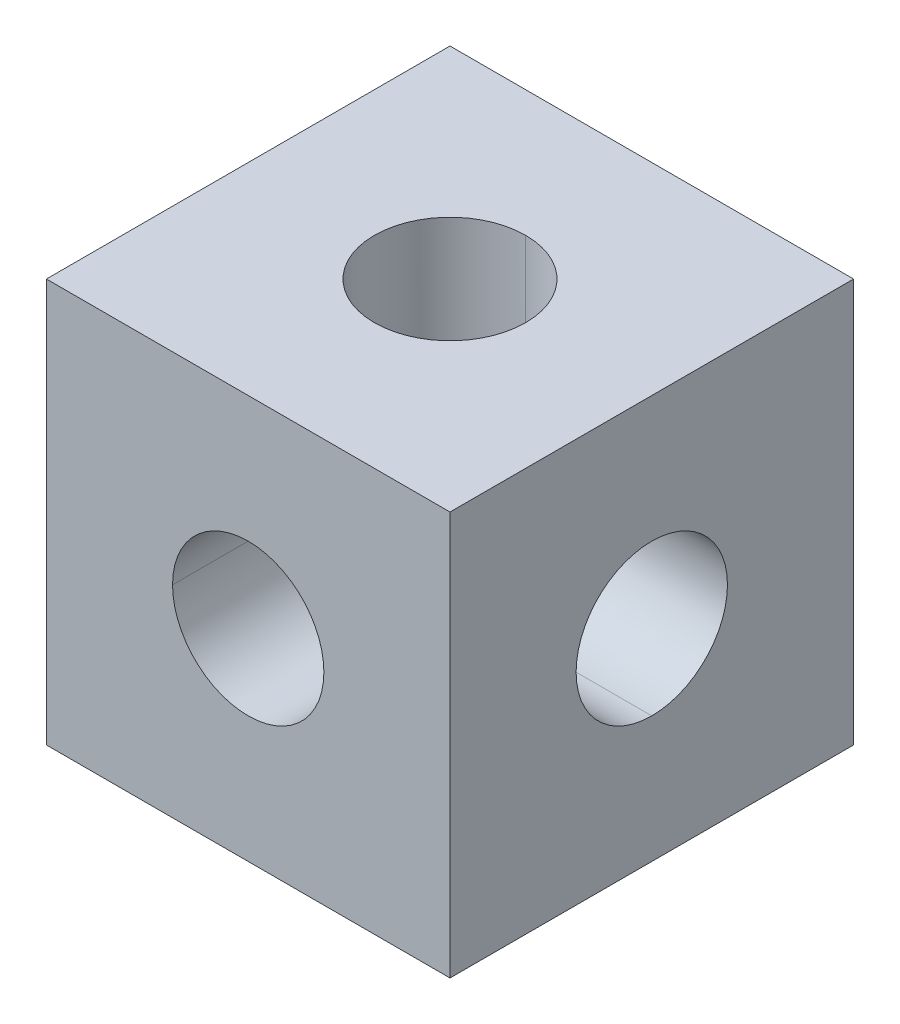
ISO-10303-21;
HEADER;
FILE_DESCRIPTION(('STEP AP214'),'2;1');
FILE_NAME('part.step','',(''),(''),'','','');
FILE_SCHEMA(('AUTOMOTIVE_DESIGN { 1 0 10303 214 1 1 1 1 }'));
ENDSEC;
DATA;
#1=APPLICATION_CONTEXT('core data for automotive mechanical design processes');
#2=APPLICATION_PROTOCOL_DEFINITION('international standard','automotive_design',2000,#1);
#3=PRODUCT_CONTEXT('',#1,'mechanical');
#4=PRODUCT('Part','Part','',(#3));
#5=PRODUCT_RELATED_PRODUCT_CATEGORY('part','',(#4));
#6=PRODUCT_DEFINITION_FORMATION('','',#4);
#7=PRODUCT_DEFINITION_CONTEXT('part definition',#1,'design');
#8=PRODUCT_DEFINITION('design','',#6,#7);
#9=PRODUCT_DEFINITION_SHAPE('','',#8);
#10=(LENGTH_UNIT() NAMED_UNIT(*) SI_UNIT(.MILLI.,.METRE.));
#11=(NAMED_UNIT(*) PLANE_ANGLE_UNIT() SI_UNIT($,.RADIAN.));
#12=(NAMED_UNIT(*) SI_UNIT($,.STERADIAN.) SOLID_ANGLE_UNIT());
#13=UNCERTAINTY_MEASURE_WITH_UNIT(LENGTH_MEASURE(1.E-05),#10,'distance_accuracy_value','');
#14=(GEOMETRIC_REPRESENTATION_CONTEXT(3) GLOBAL_UNCERTAINTY_ASSIGNED_CONTEXT((#13)) GLOBAL_UNIT_ASSIGNED_CONTEXT((#10,
#11,#12)) REPRESENTATION_CONTEXT('',''));
#15=CARTESIAN_POINT('',(0.,0.,0.));
#16=DIRECTION('',(0.,0.,1.));
#17=DIRECTION('',(1.,0.,0.));
#18=AXIS2_PLACEMENT_3D('',#15,#16,#17);
#19=CARTESIAN_POINT('',(4.,0.,4.));
#20=DIRECTION('',(-1.,0.,0.));
#21=DIRECTION('',(0.,-1.,0.));
#22=AXIS2_PLACEMENT_3D('',#19,#20,#21);
#23=CYLINDRICAL_SURFACE('',#22,1.5);
#24=CARTESIAN_POINT('',(4.,0.,4.));
#25=DIRECTION('',(-1.,0.,0.));
#26=DIRECTION('',(0.,-1.,0.));
#27=AXIS2_PLACEMENT_3D('',#24,#25,#26);
#28=CIRCLE('',#27,1.5);
#29=CARTESIAN_POINT('',(4.,1.5,4.));
#30=VERTEX_POINT('',#29);
#31=CARTESIAN_POINT('',(4.,-1.5,4.));
#32=VERTEX_POINT('',#31);
#33=EDGE_CURVE('E41',#30,#32,#28,.T.);
#34=ORIENTED_EDGE('',*,*,#33,.F.);
#35=DIRECTION('',(-1.,0.,0.));
#36=VECTOR('',#35,1.);
#37=CARTESIAN_POINT('',(4.,1.5,4.));
#38=LINE('',#37,#36);
#39=CARTESIAN_POINT('',(1.5,1.5,4.));
#40=VERTEX_POINT('',#39);
#41=EDGE_CURVE('E11',#30,#40,#38,.T.);
#42=ORIENTED_EDGE('',*,*,#41,.T.);
#43=CARTESIAN_POINT('',(1.06066017177982,1.06066017177982,2.93933982822018));
#44=CARTESIAN_POINT('',(1.34572436846349,1.34572436846349,3.22440402490385));
#45=CARTESIAN_POINT('',(1.5,1.5,3.59685834690297));
#46=CARTESIAN_POINT('',(1.5,1.5,4.));
#47=(BOUNDED_CURVE() B_SPLINE_CURVE(3,(#43,#44,#45,#46),.UNSPECIFIED.,.F.,
.F.) B_SPLINE_CURVE_WITH_KNOTS((4,4),(5.49778714378214,6.28318530717959),
.UNSPECIFIED.) CURVE() GEOMETRIC_REPRESENTATION_ITEM() RATIONAL_B_SPLINE_CURVE((1.,
0.949253021674191,0.949253021674191,1.)) REPRESENTATION_ITEM(''));
#48=CARTESIAN_POINT('',(1.06066017177982,1.06066017177982,2.93933982822018));
#49=VERTEX_POINT('',#48);
#50=EDGE_CURVE('E384',#49,#40,#47,.T.);
#51=ORIENTED_EDGE('',*,*,#50,.F.);
#52=CARTESIAN_POINT('',(1.06066017177982,1.06066017177982,2.93933982822018));
#53=CARTESIAN_POINT('',(1.34572436846349,0.775595975096153,2.65427563153651));
#54=CARTESIAN_POINT('',(1.5,0.403141653097036,2.5));
#55=CARTESIAN_POINT('',(1.5,0.,2.5));
#56=(BOUNDED_CURVE() B_SPLINE_CURVE(3,(#52,#53,#54,#55),.UNSPECIFIED.,.F.,
.F.) B_SPLINE_CURVE_WITH_KNOTS((4,4),(5.49778714378214,6.28318530717959),
.UNSPECIFIED.) CURVE() GEOMETRIC_REPRESENTATION_ITEM() RATIONAL_B_SPLINE_CURVE((1.,
0.949253021674191,0.949253021674191,1.)) REPRESENTATION_ITEM(''));
#57=CARTESIAN_POINT('',(1.5,0.,2.5));
#58=VERTEX_POINT('',#57);
#59=EDGE_CURVE('E28',#49,#58,#56,.T.);
#60=ORIENTED_EDGE('',*,*,#59,.T.);
#61=CARTESIAN_POINT('',(1.5,0.,2.5));
#62=CARTESIAN_POINT('',(1.5,-0.403141653097036,2.5));
#63=CARTESIAN_POINT('',(1.34572436846349,-0.775595975096152,2.65427563153651));
#64=CARTESIAN_POINT('',(1.06066017177982,-1.06066017177982,2.93933982822018));
#65=(BOUNDED_CURVE() B_SPLINE_CURVE(3,(#61,#62,#63,#64),.UNSPECIFIED.,.F.,
.F.) B_SPLINE_CURVE_WITH_KNOTS((4,4),(0.,0.785398163397449),
.UNSPECIFIED.) CURVE() GEOMETRIC_REPRESENTATION_ITEM() RATIONAL_B_SPLINE_CURVE((1.,
0.949253021674191,0.949253021674191,1.)) REPRESENTATION_ITEM(''));
#66=CARTESIAN_POINT('',(1.06066017177982,-1.06066017177982,2.93933982822018));
#67=VERTEX_POINT('',#66);
#68=EDGE_CURVE('E310',#58,#67,#65,.T.);
#69=ORIENTED_EDGE('',*,*,#68,.T.);
#70=CARTESIAN_POINT('',(1.5,-1.5,4.));
#71=CARTESIAN_POINT('',(1.5,-1.5,3.59685834690297));
#72=CARTESIAN_POINT('',(1.34572436846349,-1.34572436846349,3.22440402490385));
#73=CARTESIAN_POINT('',(1.06066017177982,-1.06066017177982,2.93933982822018));
#74=(BOUNDED_CURVE() B_SPLINE_CURVE(3,(#70,#71,#72,#73),.UNSPECIFIED.,.F.,
.F.) B_SPLINE_CURVE_WITH_KNOTS((4,4),(3.1415926535898,3.92699081698724),
.UNSPECIFIED.) CURVE() GEOMETRIC_REPRESENTATION_ITEM() RATIONAL_B_SPLINE_CURVE((1.,
0.949253021674191,0.949253021674191,1.)) REPRESENTATION_ITEM(''));
#75=CARTESIAN_POINT('',(1.5,-1.5,4.));
#76=VERTEX_POINT('',#75);
#77=EDGE_CURVE('E371',#76,#67,#74,.T.);
#78=ORIENTED_EDGE('',*,*,#77,.F.);
#79=DIRECTION('',(-1.,0.,0.));
#80=VECTOR('',#79,1.);
#81=CARTESIAN_POINT('',(4.,-1.5,4.));
#82=LINE('',#81,#80);
#83=EDGE_CURVE('E210',#32,#76,#82,.T.);
#84=ORIENTED_EDGE('',*,*,#83,.F.);
#85=EDGE_LOOP('',(#34,#42,#51,#60,#69,#78,#84));
#86=FACE_BOUND('',#85,.T.);
#87=ADVANCED_FACE('F17',(#86),#23,.F.);
#88=CARTESIAN_POINT('',(4.,0.,4.));
#89=DIRECTION('',(-1.,0.,0.));
#90=DIRECTION('',(0.,-1.,0.));
#91=AXIS2_PLACEMENT_3D('',#88,#89,#90);
#92=CYLINDRICAL_SURFACE('',#91,1.5);
#93=CARTESIAN_POINT('',(-1.5,1.5,4.));
#94=CARTESIAN_POINT('',(-1.5,1.5,3.59685834690297));
#95=CARTESIAN_POINT('',(-1.34572436846349,1.34572436846349,3.22440402490385));
#96=CARTESIAN_POINT('',(-1.06066017177982,1.06066017177982,2.93933982822018));
#97=(BOUNDED_CURVE() B_SPLINE_CURVE(3,(#93,#94,#95,#96),.UNSPECIFIED.,.F.,
.F.) B_SPLINE_CURVE_WITH_KNOTS((4,4),(0.,0.785398163397449),
.UNSPECIFIED.) CURVE() GEOMETRIC_REPRESENTATION_ITEM() RATIONAL_B_SPLINE_CURVE((1.,
0.949253021674191,0.949253021674191,1.)) REPRESENTATION_ITEM(''));
#98=CARTESIAN_POINT('',(-1.5,1.5,4.));
#99=VERTEX_POINT('',#98);
#100=CARTESIAN_POINT('',(-1.06066017177982,1.06066017177982,2.93933982822018));
#101=VERTEX_POINT('',#100);
#102=EDGE_CURVE('E255',#99,#101,#97,.T.);
#103=ORIENTED_EDGE('',*,*,#102,.F.);
#104=DIRECTION('',(-1.,0.,0.));
#105=VECTOR('',#104,1.);
#106=CARTESIAN_POINT('',(4.,1.5,4.));
#107=LINE('',#106,#105);
#108=CARTESIAN_POINT('',(-4.,1.5,4.));
#109=VERTEX_POINT('',#108);
#110=EDGE_CURVE('E337',#99,#109,#107,.T.);
#111=ORIENTED_EDGE('',*,*,#110,.T.);
#112=CARTESIAN_POINT('',(-4.,0.,4.));
#113=DIRECTION('',(-1.,0.,0.));
#114=DIRECTION('',(0.,-1.,0.));
#115=AXIS2_PLACEMENT_3D('',#112,#113,#114);
#116=CIRCLE('',#115,1.5);
#117=CARTESIAN_POINT('',(-4.,-1.5,4.));
#118=VERTEX_POINT('',#117);
#119=EDGE_CURVE('E341',#109,#118,#116,.T.);
#120=ORIENTED_EDGE('',*,*,#119,.T.);
#121=DIRECTION('',(-1.,0.,0.));
#122=VECTOR('',#121,1.);
#123=CARTESIAN_POINT('',(4.,-1.5,4.));
#124=LINE('',#123,#122);
#125=CARTESIAN_POINT('',(-1.5,-1.5,4.));
#126=VERTEX_POINT('',#125);
#127=EDGE_CURVE('E319',#126,#118,#124,.T.);
#128=ORIENTED_EDGE('',*,*,#127,.F.);
#129=CARTESIAN_POINT('',(-1.06066017177982,-1.06066017177982,2.93933982822018));
#130=CARTESIAN_POINT('',(-1.34572436846349,-1.34572436846349,3.22440402490385));
#131=CARTESIAN_POINT('',(-1.5,-1.5,3.59685834690297));
#132=CARTESIAN_POINT('',(-1.5,-1.5,4.));
#133=(BOUNDED_CURVE() B_SPLINE_CURVE(3,(#129,#130,#131,#132),.UNSPECIFIED.,.F.,
.F.) B_SPLINE_CURVE_WITH_KNOTS((4,4),(2.35619449019234,3.1415926535898),
.UNSPECIFIED.) CURVE() GEOMETRIC_REPRESENTATION_ITEM() RATIONAL_B_SPLINE_CURVE((1.,
0.949253021674191,0.949253021674191,1.)) REPRESENTATION_ITEM(''));
#134=CARTESIAN_POINT('',(-1.06066017177982,-1.06066017177982,2.93933982822018));
#135=VERTEX_POINT('',#134);
#136=EDGE_CURVE('E245',#135,#126,#133,.T.);
#137=ORIENTED_EDGE('',*,*,#136,.F.);
#138=CARTESIAN_POINT('',(-1.06066017177982,-1.06066017177982,2.93933982822018));
#139=CARTESIAN_POINT('',(-1.34572436846349,-0.775595975096153,2.65427563153651));
#140=CARTESIAN_POINT('',(-1.5,-0.403141653097036,2.5));
#141=CARTESIAN_POINT('',(-1.5,0.,2.5));
#142=(BOUNDED_CURVE() B_SPLINE_CURVE(3,(#138,#139,#140,#141),.UNSPECIFIED.,.F.,
.F.) B_SPLINE_CURVE_WITH_KNOTS((4,4),(5.49778714378214,6.28318530717959),
.UNSPECIFIED.) CURVE() GEOMETRIC_REPRESENTATION_ITEM() RATIONAL_B_SPLINE_CURVE((1.,
0.949253021674191,0.949253021674191,1.)) REPRESENTATION_ITEM(''));
#143=CARTESIAN_POINT('',(-1.5,0.,2.5));
#144=VERTEX_POINT('',#143);
#145=EDGE_CURVE('E432',#135,#144,#142,.T.);
#146=ORIENTED_EDGE('',*,*,#145,.T.);
#147=CARTESIAN_POINT('',(-1.5,0.,2.5));
#148=CARTESIAN_POINT('',(-1.5,0.403141653097036,2.5));
#149=CARTESIAN_POINT('',(-1.34572436846349,0.775595975096152,2.65427563153651));
#150=CARTESIAN_POINT('',(-1.06066017177982,1.06066017177982,2.93933982822018));
#151=(BOUNDED_CURVE() B_SPLINE_CURVE(3,(#147,#148,#149,#150),.UNSPECIFIED.,.F.,
.F.) B_SPLINE_CURVE_WITH_KNOTS((4,4),(0.,0.785398163397448),
.UNSPECIFIED.) CURVE() GEOMETRIC_REPRESENTATION_ITEM() RATIONAL_B_SPLINE_CURVE((1.,
0.949253021674191,0.949253021674191,1.)) REPRESENTATION_ITEM(''));
#152=EDGE_CURVE('E494',#144,#101,#151,.T.);
#153=ORIENTED_EDGE('',*,*,#152,.T.);
#154=EDGE_LOOP('',(#103,#111,#120,#128,#137,#146,#153));
#155=FACE_BOUND('',#154,.T.);
#156=ADVANCED_FACE('F605',(#155),#92,.F.);
#157=CARTESIAN_POINT('',(0.,-4.,4.));
#158=DIRECTION('',(0.,1.,0.));
#159=DIRECTION('',(0.,0.,1.));
#160=AXIS2_PLACEMENT_3D('',#157,#158,#159);
#161=CYLINDRICAL_SURFACE('',#160,1.5);
#162=CARTESIAN_POINT('',(-1.06066017177982,1.06066017177982,2.93933982822018));
#163=CARTESIAN_POINT('',(-0.775595975096153,1.34572436846349,2.65427563153651));
#164=CARTESIAN_POINT('',(-0.403141653097036,1.5,2.5));
#165=CARTESIAN_POINT('',(0.,1.5,2.5));
#166=(BOUNDED_CURVE() B_SPLINE_CURVE(3,(#162,#163,#164,#165),.UNSPECIFIED.,.F.,
.F.) B_SPLINE_CURVE_WITH_KNOTS((4,4),(5.49778714378214,6.28318530717959),
.UNSPECIFIED.) CURVE() GEOMETRIC_REPRESENTATION_ITEM() RATIONAL_B_SPLINE_CURVE((1.,
0.949253021674191,0.949253021674191,1.)) REPRESENTATION_ITEM(''));
#167=CARTESIAN_POINT('',(0.,1.5,2.5));
#168=VERTEX_POINT('',#167);
#169=EDGE_CURVE('E419',#101,#168,#166,.T.);
#170=ORIENTED_EDGE('',*,*,#169,.T.);
#171=DIRECTION('',(0.,1.,0.));
#172=VECTOR('',#171,1.);
#173=CARTESIAN_POINT('',(0.,-4.,2.5));
#174=LINE('',#173,#172);
#175=CARTESIAN_POINT('',(0.,4.,2.5));
#176=VERTEX_POINT('',#175);
#177=EDGE_CURVE('E276',#168,#176,#174,.T.);
#178=ORIENTED_EDGE('',*,*,#177,.T.);
#179=CARTESIAN_POINT('',(0.,4.,4.));
#180=DIRECTION('',(0.,1.,0.));
#181=DIRECTION('',(0.,0.,1.));
#182=AXIS2_PLACEMENT_3D('',#179,#180,#181);
#183=CIRCLE('',#182,1.5);
#184=CARTESIAN_POINT('',(0.,4.,5.5));
#185=VERTEX_POINT('',#184);
#186=EDGE_CURVE('E270',#176,#185,#183,.T.);
#187=ORIENTED_EDGE('',*,*,#186,.T.);
#188=DIRECTION('',(0.,1.,0.));
#189=VECTOR('',#188,1.);
#190=CARTESIAN_POINT('',(0.,-4.,5.5));
#191=LINE('',#190,#189);
#192=CARTESIAN_POINT('',(0.,1.5,5.5));
#193=VERTEX_POINT('',#192);
#194=EDGE_CURVE('E427',#193,#185,#191,.T.);
#195=ORIENTED_EDGE('',*,*,#194,.F.);
#196=CARTESIAN_POINT('',(0.,1.5,5.5));
#197=CARTESIAN_POINT('',(-0.403141653097035,1.5,5.5));
#198=CARTESIAN_POINT('',(-0.775595975096152,1.34572436846349,5.3457243684635));
#199=CARTESIAN_POINT('',(-1.06066017177982,1.06066017177982,5.06066017177982));
#200=(BOUNDED_CURVE() B_SPLINE_CURVE(3,(#196,#197,#198,#199),.UNSPECIFIED.,.F.,
.F.) B_SPLINE_CURVE_WITH_KNOTS((4,4),(3.1415926535898,3.92699081698724),
.UNSPECIFIED.) CURVE() GEOMETRIC_REPRESENTATION_ITEM() RATIONAL_B_SPLINE_CURVE((1.,
0.949253021674191,0.949253021674191,1.)) REPRESENTATION_ITEM(''));
#201=CARTESIAN_POINT('',(-1.06066017177982,1.06066017177982,5.06066017177982));
#202=VERTEX_POINT('',#201);
#203=EDGE_CURVE('E261',#193,#202,#200,.T.);
#204=ORIENTED_EDGE('',*,*,#203,.T.);
#205=CARTESIAN_POINT('',(-1.06066017177982,1.06066017177982,5.06066017177982));
#206=CARTESIAN_POINT('',(-1.34572436846349,1.34572436846349,4.77559597509615));
#207=CARTESIAN_POINT('',(-1.5,1.5,4.40314165309704));
#208=CARTESIAN_POINT('',(-1.5,1.5,4.));
#209=(BOUNDED_CURVE() B_SPLINE_CURVE(3,(#205,#206,#207,#208),.UNSPECIFIED.,.F.,
.F.) B_SPLINE_CURVE_WITH_KNOTS((4,4),(5.49778714378214,6.28318530717959),
.UNSPECIFIED.) CURVE() GEOMETRIC_REPRESENTATION_ITEM() RATIONAL_B_SPLINE_CURVE((1.,
0.949253021674191,0.949253021674191,1.)) REPRESENTATION_ITEM(''));
#210=EDGE_CURVE('E260',#202,#99,#209,.T.);
#211=ORIENTED_EDGE('',*,*,#210,.T.);
#212=ORIENTED_EDGE('',*,*,#102,.T.);
#213=EDGE_LOOP('',(#170,#178,#187,#195,#204,#211,#212));
#214=FACE_BOUND('',#213,.T.);
#215=ADVANCED_FACE('F610',(#214),#161,.F.);
#216=CARTESIAN_POINT('',(0.,-4.,4.));
#217=DIRECTION('',(0.,1.,0.));
#218=DIRECTION('',(0.,0.,1.));
#219=AXIS2_PLACEMENT_3D('',#216,#217,#218);
#220=CYLINDRICAL_SURFACE('',#219,1.5);
#221=CARTESIAN_POINT('',(0.,-4.,4.));
#222=DIRECTION('',(0.,1.,0.));
#223=DIRECTION('',(0.,0.,1.));
#224=AXIS2_PLACEMENT_3D('',#221,#222,#223);
#225=CIRCLE('',#224,1.5);
#226=CARTESIAN_POINT('',(0.,-4.,2.5));
#227=VERTEX_POINT('',#226);
#228=CARTESIAN_POINT('',(0.,-4.,5.5));
#229=VERTEX_POINT('',#228);
#230=EDGE_CURVE('E347',#227,#229,#225,.T.);
#231=ORIENTED_EDGE('',*,*,#230,.F.);
#232=DIRECTION('',(0.,1.,0.));
#233=VECTOR('',#232,1.);
#234=CARTESIAN_POINT('',(0.,-4.,2.5));
#235=LINE('',#234,#233);
#236=CARTESIAN_POINT('',(0.,-1.5,2.5));
#237=VERTEX_POINT('',#236);
#238=EDGE_CURVE('E244',#227,#237,#235,.T.);
#239=ORIENTED_EDGE('',*,*,#238,.T.);
#240=CARTESIAN_POINT('',(0.,-1.5,2.5));
#241=CARTESIAN_POINT('',(-0.403141653097036,-1.5,2.5));
#242=CARTESIAN_POINT('',(-0.775595975096152,-1.34572436846349,2.65427563153651));
#243=CARTESIAN_POINT('',(-1.06066017177982,-1.06066017177982,2.93933982822018));
#244=(BOUNDED_CURVE() B_SPLINE_CURVE(3,(#240,#241,#242,#243),.UNSPECIFIED.,.F.,
.F.) B_SPLINE_CURVE_WITH_KNOTS((4,4),(0.,0.785398163397448),
.UNSPECIFIED.) CURVE() GEOMETRIC_REPRESENTATION_ITEM() RATIONAL_B_SPLINE_CURVE((1.,
0.949253021674191,0.949253021674191,1.)) REPRESENTATION_ITEM(''));
#245=EDGE_CURVE('E236',#237,#135,#244,.T.);
#246=ORIENTED_EDGE('',*,*,#245,.T.);
#247=ORIENTED_EDGE('',*,*,#136,.T.);
#248=CARTESIAN_POINT('',(-1.5,-1.5,4.));
#249=CARTESIAN_POINT('',(-1.5,-1.5,4.40314165309704));
#250=CARTESIAN_POINT('',(-1.34572436846349,-1.34572436846349,4.77559597509615));
#251=CARTESIAN_POINT('',(-1.06066017177982,-1.06066017177982,5.06066017177982));
#252=(BOUNDED_CURVE() B_SPLINE_CURVE(3,(#248,#249,#250,#251),.UNSPECIFIED.,.F.,
.F.) B_SPLINE_CURVE_WITH_KNOTS((4,4),(3.1415926535898,3.92699081698724),
.UNSPECIFIED.) CURVE() GEOMETRIC_REPRESENTATION_ITEM() RATIONAL_B_SPLINE_CURVE((1.,
0.949253021674191,0.949253021674191,1.)) REPRESENTATION_ITEM(''));
#253=CARTESIAN_POINT('',(-1.06066017177982,-1.06066017177982,5.06066017177982));
#254=VERTEX_POINT('',#253);
#255=EDGE_CURVE('E323',#126,#254,#252,.T.);
#256=ORIENTED_EDGE('',*,*,#255,.T.);
#257=CARTESIAN_POINT('',(-1.06066017177982,-1.06066017177982,5.06066017177982));
#258=CARTESIAN_POINT('',(-0.775595975096152,-1.34572436846349,5.3457243684635));
#259=CARTESIAN_POINT('',(-0.403141653097035,-1.5,5.5));
#260=CARTESIAN_POINT('',(0.,-1.5,5.5));
#261=(BOUNDED_CURVE() B_SPLINE_CURVE(3,(#257,#258,#259,#260),.UNSPECIFIED.,.F.,
.F.) B_SPLINE_CURVE_WITH_KNOTS((4,4),(2.35619449019234,3.1415926535898),
.UNSPECIFIED.) CURVE() GEOMETRIC_REPRESENTATION_ITEM() RATIONAL_B_SPLINE_CURVE((1.,
0.949253021674191,0.949253021674191,1.)) REPRESENTATION_ITEM(''));
#262=CARTESIAN_POINT('',(0.,-1.5,5.5));
#263=VERTEX_POINT('',#262);
#264=EDGE_CURVE('E292',#254,#263,#261,.T.);
#265=ORIENTED_EDGE('',*,*,#264,.T.);
#266=DIRECTION('',(0.,1.,0.));
#267=VECTOR('',#266,1.);
#268=CARTESIAN_POINT('',(0.,-4.,5.5));
#269=LINE('',#268,#267);
#270=EDGE_CURVE('E353',#229,#263,#269,.T.);
#271=ORIENTED_EDGE('',*,*,#270,.F.);
#272=EDGE_LOOP('',(#231,#239,#246,#247,#256,#265,#271));
#273=FACE_BOUND('',#272,.T.);
#274=ADVANCED_FACE('F362',(#273),#220,.F.);
#275=CARTESIAN_POINT('',(0.,0.,8.));
#276=DIRECTION('',(0.,0.,-1.));
#277=DIRECTION('',(-1.,0.,0.));
#278=AXIS2_PLACEMENT_3D('',#275,#276,#277);
#279=CYLINDRICAL_SURFACE('',#278,1.5);
#280=ORIENTED_EDGE('',*,*,#68,.F.);
#281=DIRECTION('',(0.,0.,-1.));
#282=VECTOR('',#281,1.);
#283=CARTESIAN_POINT('',(1.5,0.,8.));
#284=LINE('',#283,#282);
#285=CARTESIAN_POINT('',(1.5,0.,0.));
#286=VERTEX_POINT('',#285);
#287=EDGE_CURVE('E289',#58,#286,#284,.T.);
#288=ORIENTED_EDGE('',*,*,#287,.T.);
#289=CARTESIAN_POINT('',(0.,0.,0.));
#290=DIRECTION('',(0.,0.,1.));
#291=DIRECTION('',(1.,0.,0.));
#292=AXIS2_PLACEMENT_3D('',#289,#290,#291);
#293=CIRCLE('',#292,1.5);
#294=CARTESIAN_POINT('',(-1.5,0.,0.));
#295=VERTEX_POINT('',#294);
#296=EDGE_CURVE('E329',#295,#286,#293,.T.);
#297=ORIENTED_EDGE('',*,*,#296,.F.);
#298=DIRECTION('',(0.,0.,-1.));
#299=VECTOR('',#298,1.);
#300=CARTESIAN_POINT('',(-1.5,0.,8.));
#301=LINE('',#300,#299);
#302=EDGE_CURVE('E351',#144,#295,#301,.T.);
#303=ORIENTED_EDGE('',*,*,#302,.F.);
#304=ORIENTED_EDGE('',*,*,#145,.F.);
#305=ORIENTED_EDGE('',*,*,#245,.F.);
#306=CARTESIAN_POINT('',(1.06066017177982,-1.06066017177982,2.93933982822018));
#307=CARTESIAN_POINT('',(0.775595975096153,-1.34572436846349,2.65427563153651));
#308=CARTESIAN_POINT('',(0.403141653097036,-1.5,2.5));
#309=CARTESIAN_POINT('',(0.,-1.5,2.5));
#310=(BOUNDED_CURVE() B_SPLINE_CURVE(3,(#306,#307,#308,#309),.UNSPECIFIED.,.F.,
.F.) B_SPLINE_CURVE_WITH_KNOTS((4,4),(5.49778714378214,6.28318530717959),
.UNSPECIFIED.) CURVE() GEOMETRIC_REPRESENTATION_ITEM() RATIONAL_B_SPLINE_CURVE((1.,
0.949253021674191,0.949253021674191,1.)) REPRESENTATION_ITEM(''));
#311=EDGE_CURVE('E368',#67,#237,#310,.T.);
#312=ORIENTED_EDGE('',*,*,#311,.F.);
#313=EDGE_LOOP('',(#280,#288,#297,#303,#304,#305,#312));
#314=FACE_BOUND('',#313,.T.);
#315=ADVANCED_FACE('F539',(#314),#279,.F.);
#316=CARTESIAN_POINT('',(0.,0.,8.));
#317=DIRECTION('',(0.,0.,-1.));
#318=DIRECTION('',(-1.,0.,0.));
#319=AXIS2_PLACEMENT_3D('',#316,#317,#318);
#320=CYLINDRICAL_SURFACE('',#319,1.5);
#321=CARTESIAN_POINT('',(0.,0.,8.));
#322=DIRECTION('',(0.,0.,1.));
#323=DIRECTION('',(1.,0.,0.));
#324=AXIS2_PLACEMENT_3D('',#321,#322,#323);
#325=CIRCLE('',#324,1.5);
#326=CARTESIAN_POINT('',(-1.5,0.,8.));
#327=VERTEX_POINT('',#326);
#328=CARTESIAN_POINT('',(1.5,0.,8.));
#329=VERTEX_POINT('',#328);
#330=EDGE_CURVE('E216',#327,#329,#325,.T.);
#331=ORIENTED_EDGE('',*,*,#330,.T.);
#332=DIRECTION('',(0.,0.,-1.));
#333=VECTOR('',#332,1.);
#334=CARTESIAN_POINT('',(1.5,0.,8.));
#335=LINE('',#334,#333);
#336=CARTESIAN_POINT('',(1.5,0.,5.5));
#337=VERTEX_POINT('',#336);
#338=EDGE_CURVE('E213',#329,#337,#335,.T.);
#339=ORIENTED_EDGE('',*,*,#338,.T.);
#340=CARTESIAN_POINT('',(1.06066017177982,-1.06066017177982,5.06066017177982));
#341=CARTESIAN_POINT('',(1.34572436846349,-0.775595975096152,5.3457243684635));
#342=CARTESIAN_POINT('',(1.5,-0.403141653097036,5.5));
#343=CARTESIAN_POINT('',(1.5,0.,5.5));
#344=(BOUNDED_CURVE() B_SPLINE_CURVE(3,(#340,#341,#342,#343),.UNSPECIFIED.,.F.,
.F.) B_SPLINE_CURVE_WITH_KNOTS((4,4),(2.35619449019234,3.1415926535898),
.UNSPECIFIED.) CURVE() GEOMETRIC_REPRESENTATION_ITEM() RATIONAL_B_SPLINE_CURVE((1.,
0.949253021674191,0.949253021674191,1.)) REPRESENTATION_ITEM(''));
#345=CARTESIAN_POINT('',(1.06066017177982,-1.06066017177982,5.06066017177982));
#346=VERTEX_POINT('',#345);
#347=EDGE_CURVE('E197',#346,#337,#344,.T.);
#348=ORIENTED_EDGE('',*,*,#347,.F.);
#349=CARTESIAN_POINT('',(0.,-1.5,5.5));
#350=CARTESIAN_POINT('',(0.403141653097036,-1.5,5.5));
#351=CARTESIAN_POINT('',(0.775595975096153,-1.34572436846349,5.3457243684635));
#352=CARTESIAN_POINT('',(1.06066017177982,-1.06066017177982,5.06066017177982));
#353=(BOUNDED_CURVE() B_SPLINE_CURVE(3,(#349,#350,#351,#352),.UNSPECIFIED.,.F.,
.F.) B_SPLINE_CURVE_WITH_KNOTS((4,4),(3.1415926535898,3.92699081698724),
.UNSPECIFIED.) CURVE() GEOMETRIC_REPRESENTATION_ITEM() RATIONAL_B_SPLINE_CURVE((1.,
0.949253021674191,0.949253021674191,1.)) REPRESENTATION_ITEM(''));
#354=EDGE_CURVE('E434',#263,#346,#353,.T.);
#355=ORIENTED_EDGE('',*,*,#354,.F.);
#356=ORIENTED_EDGE('',*,*,#264,.F.);
#357=CARTESIAN_POINT('',(-1.5,0.,5.5));
#358=CARTESIAN_POINT('',(-1.5,-0.403141653097036,5.5));
#359=CARTESIAN_POINT('',(-1.34572436846349,-0.775595975096152,5.3457243684635));
#360=CARTESIAN_POINT('',(-1.06066017177982,-1.06066017177982,5.06066017177982));
#361=(BOUNDED_CURVE() B_SPLINE_CURVE(3,(#357,#358,#359,#360),.UNSPECIFIED.,.F.,
.F.) B_SPLINE_CURVE_WITH_KNOTS((4,4),(3.1415926535898,3.92699081698724),
.UNSPECIFIED.) CURVE() GEOMETRIC_REPRESENTATION_ITEM() RATIONAL_B_SPLINE_CURVE((1.,
0.949253021674191,0.949253021674191,1.)) REPRESENTATION_ITEM(''));
#362=CARTESIAN_POINT('',(-1.5,0.,5.5));
#363=VERTEX_POINT('',#362);
#364=EDGE_CURVE('E301',#363,#254,#361,.T.);
#365=ORIENTED_EDGE('',*,*,#364,.F.);
#366=DIRECTION('',(0.,0.,-1.));
#367=VECTOR('',#366,1.);
#368=CARTESIAN_POINT('',(-1.5,0.,8.));
#369=LINE('',#368,#367);
#370=EDGE_CURVE('E21',#327,#363,#369,.T.);
#371=ORIENTED_EDGE('',*,*,#370,.F.);
#372=EDGE_LOOP('',(#331,#339,#348,#355,#356,#365,#371));
#373=FACE_BOUND('',#372,.T.);
#374=ADVANCED_FACE('F214',(#373),#320,.F.);
#375=CARTESIAN_POINT('',(0.,0.,8.));
#376=DIRECTION('',(0.,0.,-1.));
#377=DIRECTION('',(-1.,0.,0.));
#378=AXIS2_PLACEMENT_3D('',#375,#376,#377);
#379=CYLINDRICAL_SURFACE('',#378,1.5);
#380=ORIENTED_EDGE('',*,*,#338,.F.);
#381=CARTESIAN_POINT('',(0.,0.,8.));
#382=DIRECTION('',(0.,0.,1.));
#383=DIRECTION('',(1.,0.,0.));
#384=AXIS2_PLACEMENT_3D('',#381,#382,#383);
#385=CIRCLE('',#384,1.5);
#386=EDGE_CURVE('E221',#329,#327,#385,.T.);
#387=ORIENTED_EDGE('',*,*,#386,.T.);
#388=ORIENTED_EDGE('',*,*,#370,.T.);
#389=CARTESIAN_POINT('',(-1.06066017177982,1.06066017177982,5.06066017177982));
#390=CARTESIAN_POINT('',(-1.34572436846349,0.775595975096152,5.3457243684635));
#391=CARTESIAN_POINT('',(-1.5,0.403141653097035,5.5));
#392=CARTESIAN_POINT('',(-1.5,0.,5.5));
#393=(BOUNDED_CURVE() B_SPLINE_CURVE(3,(#389,#390,#391,#392),.UNSPECIFIED.,.F.,
.F.) B_SPLINE_CURVE_WITH_KNOTS((4,4),(2.35619449019234,3.1415926535898),
.UNSPECIFIED.) CURVE() GEOMETRIC_REPRESENTATION_ITEM() RATIONAL_B_SPLINE_CURVE((1.,
0.949253021674191,0.949253021674191,1.)) REPRESENTATION_ITEM(''));
#394=EDGE_CURVE('E294',#202,#363,#393,.T.);
#395=ORIENTED_EDGE('',*,*,#394,.F.);
#396=ORIENTED_EDGE('',*,*,#203,.F.);
#397=CARTESIAN_POINT('',(1.06066017177982,1.06066017177982,5.06066017177982));
#398=CARTESIAN_POINT('',(0.775595975096152,1.34572436846349,5.3457243684635));
#399=CARTESIAN_POINT('',(0.403141653097036,1.5,5.5));
#400=CARTESIAN_POINT('',(0.,1.5,5.5));
#401=(BOUNDED_CURVE() B_SPLINE_CURVE(3,(#397,#398,#399,#400),.UNSPECIFIED.,.F.,
.F.) B_SPLINE_CURVE_WITH_KNOTS((4,4),(2.35619449019234,3.1415926535898),
.UNSPECIFIED.) CURVE() GEOMETRIC_REPRESENTATION_ITEM() RATIONAL_B_SPLINE_CURVE((1.,
0.949253021674191,0.949253021674191,1.)) REPRESENTATION_ITEM(''));
#402=CARTESIAN_POINT('',(1.06066017177982,1.06066017177982,5.06066017177982));
#403=VERTEX_POINT('',#402);
#404=EDGE_CURVE('E225',#403,#193,#401,.T.);
#405=ORIENTED_EDGE('',*,*,#404,.F.);
#406=CARTESIAN_POINT('',(1.5,0.,5.5));
#407=CARTESIAN_POINT('',(1.5,0.403141653097036,5.5));
#408=CARTESIAN_POINT('',(1.34572436846349,0.775595975096153,5.3457243684635));
#409=CARTESIAN_POINT('',(1.06066017177982,1.06066017177982,5.06066017177982));
#410=(BOUNDED_CURVE() B_SPLINE_CURVE(3,(#406,#407,#408,#409),.UNSPECIFIED.,.F.,
.F.) B_SPLINE_CURVE_WITH_KNOTS((4,4),(3.1415926535898,3.92699081698724),
.UNSPECIFIED.) CURVE() GEOMETRIC_REPRESENTATION_ITEM() RATIONAL_B_SPLINE_CURVE((1.,
0.949253021674191,0.949253021674191,1.)) REPRESENTATION_ITEM(''));
#411=EDGE_CURVE('E202',#337,#403,#410,.T.);
#412=ORIENTED_EDGE('',*,*,#411,.F.);
#413=EDGE_LOOP('',(#380,#387,#388,#395,#396,#405,#412));
#414=FACE_BOUND('',#413,.T.);
#415=ADVANCED_FACE('F19',(#414),#379,.F.);
#416=CARTESIAN_POINT('',(0.,0.,8.));
#417=DIRECTION('',(0.,0.,1.));
#418=DIRECTION('',(1.,0.,0.));
#419=AXIS2_PLACEMENT_3D('',#416,#417,#418);
#420=PLANE('',#419);
#421=DIRECTION('',(0.,1.,0.));
#422=VECTOR('',#421,1.);
#423=CARTESIAN_POINT('',(4.,4.,8.));
#424=LINE('',#423,#422);
#425=CARTESIAN_POINT('',(4.,-4.,8.));
#426=VERTEX_POINT('',#425);
#427=CARTESIAN_POINT('',(4.,4.,8.));
#428=VERTEX_POINT('',#427);
#429=EDGE_CURVE('E253',#426,#428,#424,.T.);
#430=ORIENTED_EDGE('',*,*,#429,.T.);
#431=DIRECTION('',(-1.,0.,0.));
#432=VECTOR('',#431,1.);
#433=CARTESIAN_POINT('',(-4.,4.,8.));
#434=LINE('',#433,#432);
#435=CARTESIAN_POINT('',(-4.,4.,8.));
#436=VERTEX_POINT('',#435);
#437=EDGE_CURVE('E246',#428,#436,#434,.T.);
#438=ORIENTED_EDGE('',*,*,#437,.T.);
#439=DIRECTION('',(0.,-1.,0.));
#440=VECTOR('',#439,1.);
#441=CARTESIAN_POINT('',(-4.,4.,8.));
#442=LINE('',#441,#440);
#443=CARTESIAN_POINT('',(-4.,-4.,8.));
#444=VERTEX_POINT('',#443);
#445=EDGE_CURVE('E254',#436,#444,#442,.T.);
#446=ORIENTED_EDGE('',*,*,#445,.T.);
#447=DIRECTION('',(1.,0.,0.));
#448=VECTOR('',#447,1.);
#449=CARTESIAN_POINT('',(-4.,-4.,8.));
#450=LINE('',#449,#448);
#451=EDGE_CURVE('E335',#444,#426,#450,.T.);
#452=ORIENTED_EDGE('',*,*,#451,.T.);
#453=EDGE_LOOP('',(#430,#438,#446,#452));
#454=FACE_BOUND('',#453,.T.);
#455=ORIENTED_EDGE('',*,*,#330,.F.);
#456=ORIENTED_EDGE('',*,*,#386,.F.);
#457=EDGE_LOOP('',(#455,#456));
#458=FACE_BOUND('',#457,.T.);
#459=ADVANCED_FACE('F583',(#454,#458),#420,.T.);
#460=CARTESIAN_POINT('',(0.,0.,0.));
#461=DIRECTION('',(0.,0.,1.));
#462=DIRECTION('',(1.,0.,0.));
#463=AXIS2_PLACEMENT_3D('',#460,#461,#462);
#464=PLANE('',#463);
#465=DIRECTION('',(0.,1.,0.));
#466=VECTOR('',#465,1.);
#467=CARTESIAN_POINT('',(4.,4.,0.));
#468=LINE('',#467,#466);
#469=CARTESIAN_POINT('',(4.,-4.,0.));
#470=VERTEX_POINT('',#469);
#471=CARTESIAN_POINT('',(4.,4.,0.));
#472=VERTEX_POINT('',#471);
#473=EDGE_CURVE('E287',#470,#472,#468,.T.);
#474=ORIENTED_EDGE('',*,*,#473,.F.);
#475=DIRECTION('',(1.,0.,0.));
#476=VECTOR('',#475,1.);
#477=CARTESIAN_POINT('',(-4.,-4.,0.));
#478=LINE('',#477,#476);
#479=CARTESIAN_POINT('',(-4.,-4.,0.));
#480=VERTEX_POINT('',#479);
#481=EDGE_CURVE('E467',#480,#470,#478,.T.);
#482=ORIENTED_EDGE('',*,*,#481,.F.);
#483=DIRECTION('',(0.,-1.,0.));
#484=VECTOR('',#483,1.);
#485=CARTESIAN_POINT('',(-4.,4.,0.));
#486=LINE('',#485,#484);
#487=CARTESIAN_POINT('',(-4.,4.,0.));
#488=VERTEX_POINT('',#487);
#489=EDGE_CURVE('E422',#488,#480,#486,.T.);
#490=ORIENTED_EDGE('',*,*,#489,.F.);
#491=DIRECTION('',(-1.,0.,0.));
#492=VECTOR('',#491,1.);
#493=CARTESIAN_POINT('',(-4.,4.,0.));
#494=LINE('',#493,#492);
#495=EDGE_CURVE('E311',#472,#488,#494,.T.);
#496=ORIENTED_EDGE('',*,*,#495,.F.);
#497=EDGE_LOOP('',(#474,#482,#490,#496));
#498=FACE_BOUND('',#497,.T.);
#499=ORIENTED_EDGE('',*,*,#296,.T.);
#500=CARTESIAN_POINT('',(0.,0.,0.));
#501=DIRECTION('',(0.,0.,1.));
#502=DIRECTION('',(1.,0.,0.));
#503=AXIS2_PLACEMENT_3D('',#500,#501,#502);
#504=CIRCLE('',#503,1.5);
#505=EDGE_CURVE('E336',#286,#295,#504,.T.);
#506=ORIENTED_EDGE('',*,*,#505,.T.);
#507=EDGE_LOOP('',(#499,#506));
#508=FACE_BOUND('',#507,.T.);
#509=ADVANCED_FACE('F625',(#498,#508),#464,.F.);
#510=CARTESIAN_POINT('',(4.,4.,8.));
#511=DIRECTION('',(-1.,0.,0.));
#512=DIRECTION('',(0.,1.,0.));
#513=AXIS2_PLACEMENT_3D('',#510,#511,#512);
#514=PLANE('',#513);
#515=ORIENTED_EDGE('',*,*,#473,.T.);
#516=DIRECTION('',(0.,0.,-1.));
#517=VECTOR('',#516,1.);
#518=CARTESIAN_POINT('',(4.,4.,8.));
#519=LINE('',#518,#517);
#520=EDGE_CURVE('E318',#428,#472,#519,.T.);
#521=ORIENTED_EDGE('',*,*,#520,.F.);
#522=ORIENTED_EDGE('',*,*,#429,.F.);
#523=DIRECTION('',(0.,0.,-1.));
#524=VECTOR('',#523,1.);
#525=CARTESIAN_POINT('',(4.,-4.,8.));
#526=LINE('',#525,#524);
#527=EDGE_CURVE('E280',#426,#470,#526,.T.);
#528=ORIENTED_EDGE('',*,*,#527,.T.);
#529=EDGE_LOOP('',(#515,#521,#522,#528));
#530=FACE_BOUND('',#529,.T.);
#531=CARTESIAN_POINT('',(4.,0.,4.));
#532=DIRECTION('',(-1.,0.,0.));
#533=DIRECTION('',(0.,-1.,0.));
#534=AXIS2_PLACEMENT_3D('',#531,#532,#533);
#535=CIRCLE('',#534,1.5);
#536=EDGE_CURVE('E288',#32,#30,#535,.T.);
#537=ORIENTED_EDGE('',*,*,#536,.T.);
#538=ORIENTED_EDGE('',*,*,#33,.T.);
#539=EDGE_LOOP('',(#537,#538));
#540=FACE_BOUND('',#539,.T.);
#541=ADVANCED_FACE('F587',(#530,#540),#514,.F.);
#542=CARTESIAN_POINT('',(-4.,4.,8.));
#543=DIRECTION('',(0.,-1.,0.));
#544=DIRECTION('',(0.,0.,-1.));
#545=AXIS2_PLACEMENT_3D('',#542,#543,#544);
#546=PLANE('',#545);
#547=ORIENTED_EDGE('',*,*,#495,.T.);
#548=DIRECTION('',(0.,0.,-1.));
#549=VECTOR('',#548,1.);
#550=CARTESIAN_POINT('',(-4.,4.,8.));
#551=LINE('',#550,#549);
#552=EDGE_CURVE('E426',#436,#488,#551,.T.);
#553=ORIENTED_EDGE('',*,*,#552,.F.);
#554=ORIENTED_EDGE('',*,*,#437,.F.);
#555=ORIENTED_EDGE('',*,*,#520,.T.);
#556=EDGE_LOOP('',(#547,#553,#554,#555));
#557=FACE_BOUND('',#556,.T.);
#558=CARTESIAN_POINT('',(0.,4.,4.));
#559=DIRECTION('',(0.,1.,0.));
#560=DIRECTION('',(0.,0.,1.));
#561=AXIS2_PLACEMENT_3D('',#558,#559,#560);
#562=CIRCLE('',#561,1.5);
#563=EDGE_CURVE('E300',#185,#176,#562,.T.);
#564=ORIENTED_EDGE('',*,*,#563,.F.);
#565=ORIENTED_EDGE('',*,*,#186,.F.);
#566=EDGE_LOOP('',(#564,#565));
#567=FACE_BOUND('',#566,.T.);
#568=ADVANCED_FACE('F600',(#557,#567),#546,.F.);
#569=CARTESIAN_POINT('',(-4.,4.,8.));
#570=DIRECTION('',(1.,0.,0.));
#571=DIRECTION('',(0.,1.,0.));
#572=AXIS2_PLACEMENT_3D('',#569,#570,#571);
#573=PLANE('',#572);
#574=ORIENTED_EDGE('',*,*,#489,.T.);
#575=DIRECTION('',(0.,0.,-1.));
#576=VECTOR('',#575,1.);
#577=CARTESIAN_POINT('',(-4.,-4.,8.));
#578=LINE('',#577,#576);
#579=EDGE_CURVE('E346',#444,#480,#578,.T.);
#580=ORIENTED_EDGE('',*,*,#579,.F.);
#581=ORIENTED_EDGE('',*,*,#445,.F.);
#582=ORIENTED_EDGE('',*,*,#552,.T.);
#583=EDGE_LOOP('',(#574,#580,#581,#582));
#584=FACE_BOUND('',#583,.T.);
#585=CARTESIAN_POINT('',(-4.,0.,4.));
#586=DIRECTION('',(-1.,0.,0.));
#587=DIRECTION('',(0.,-1.,0.));
#588=AXIS2_PLACEMENT_3D('',#585,#586,#587);
#589=CIRCLE('',#588,1.5);
#590=EDGE_CURVE('E322',#118,#109,#589,.T.);
#591=ORIENTED_EDGE('',*,*,#590,.F.);
#592=ORIENTED_EDGE('',*,*,#119,.F.);
#593=EDGE_LOOP('',(#591,#592));
#594=FACE_BOUND('',#593,.T.);
#595=ADVANCED_FACE('F592',(#584,#594),#573,.F.);
#596=CARTESIAN_POINT('',(-4.,-4.,8.));
#597=DIRECTION('',(0.,1.,0.));
#598=DIRECTION('',(1.,0.,0.));
#599=AXIS2_PLACEMENT_3D('',#596,#597,#598);
#600=PLANE('',#599);
#601=ORIENTED_EDGE('',*,*,#481,.T.);
#602=ORIENTED_EDGE('',*,*,#527,.F.);
#603=ORIENTED_EDGE('',*,*,#451,.F.);
#604=ORIENTED_EDGE('',*,*,#579,.T.);
#605=EDGE_LOOP('',(#601,#602,#603,#604));
#606=FACE_BOUND('',#605,.T.);
#607=CARTESIAN_POINT('',(0.,-4.,4.));
#608=DIRECTION('',(0.,1.,0.));
#609=DIRECTION('',(0.,0.,1.));
#610=AXIS2_PLACEMENT_3D('',#607,#608,#609);
#611=CIRCLE('',#610,1.5);
#612=EDGE_CURVE('E342',#229,#227,#611,.T.);
#613=ORIENTED_EDGE('',*,*,#612,.T.);
#614=ORIENTED_EDGE('',*,*,#230,.T.);
#615=EDGE_LOOP('',(#613,#614));
#616=FACE_BOUND('',#615,.T.);
#617=ADVANCED_FACE('F589',(#606,#616),#600,.F.);
#618=CARTESIAN_POINT('',(0.,0.,8.));
#619=DIRECTION('',(0.,0.,-1.));
#620=DIRECTION('',(-1.,0.,0.));
#621=AXIS2_PLACEMENT_3D('',#618,#619,#620);
#622=CYLINDRICAL_SURFACE('',#621,1.5);
#623=ORIENTED_EDGE('',*,*,#287,.F.);
#624=ORIENTED_EDGE('',*,*,#59,.F.);
#625=CARTESIAN_POINT('',(0.,1.5,2.5));
#626=CARTESIAN_POINT('',(0.403141653097036,1.5,2.5));
#627=CARTESIAN_POINT('',(0.775595975096152,1.34572436846349,2.65427563153651));
#628=CARTESIAN_POINT('',(1.06066017177982,1.06066017177982,2.93933982822018));
#629=(BOUNDED_CURVE() B_SPLINE_CURVE(3,(#625,#626,#627,#628),.UNSPECIFIED.,.F.,
.F.) B_SPLINE_CURVE_WITH_KNOTS((4,4),(0.,0.785398163397448),
.UNSPECIFIED.) CURVE() GEOMETRIC_REPRESENTATION_ITEM() RATIONAL_B_SPLINE_CURVE((1.,
0.949253021674191,0.949253021674191,1.)) REPRESENTATION_ITEM(''));
#630=EDGE_CURVE('E375',#168,#49,#629,.T.);
#631=ORIENTED_EDGE('',*,*,#630,.F.);
#632=ORIENTED_EDGE('',*,*,#169,.F.);
#633=ORIENTED_EDGE('',*,*,#152,.F.);
#634=ORIENTED_EDGE('',*,*,#302,.T.);
#635=ORIENTED_EDGE('',*,*,#505,.F.);
#636=EDGE_LOOP('',(#623,#624,#631,#632,#633,#634,#635));
#637=FACE_BOUND('',#636,.T.);
#638=ADVANCED_FACE('F545',(#637),#622,.F.);
#639=CARTESIAN_POINT('',(0.,-4.,4.));
#640=DIRECTION('',(0.,1.,0.));
#641=DIRECTION('',(0.,0.,1.));
#642=AXIS2_PLACEMENT_3D('',#639,#640,#641);
#643=CYLINDRICAL_SURFACE('',#642,1.5);
#644=ORIENTED_EDGE('',*,*,#238,.F.);
#645=ORIENTED_EDGE('',*,*,#612,.F.);
#646=ORIENTED_EDGE('',*,*,#270,.T.);
#647=ORIENTED_EDGE('',*,*,#354,.T.);
#648=CARTESIAN_POINT('',(1.06066017177982,-1.06066017177982,5.06066017177982));
#649=CARTESIAN_POINT('',(1.34572436846349,-1.34572436846349,4.77559597509615));
#650=CARTESIAN_POINT('',(1.5,-1.5,4.40314165309704));
#651=CARTESIAN_POINT('',(1.5,-1.5,4.));
#652=(BOUNDED_CURVE() B_SPLINE_CURVE(3,(#648,#649,#650,#651),.UNSPECIFIED.,.F.,
.F.) B_SPLINE_CURVE_WITH_KNOTS((4,4),(2.35619449019234,3.1415926535898),
.UNSPECIFIED.) CURVE() GEOMETRIC_REPRESENTATION_ITEM() RATIONAL_B_SPLINE_CURVE((1.,
0.949253021674191,0.949253021674191,1.)) REPRESENTATION_ITEM(''));
#653=EDGE_CURVE('E205',#346,#76,#652,.T.);
#654=ORIENTED_EDGE('',*,*,#653,.T.);
#655=ORIENTED_EDGE('',*,*,#77,.T.);
#656=ORIENTED_EDGE('',*,*,#311,.T.);
#657=EDGE_LOOP('',(#644,#645,#646,#647,#654,#655,#656));
#658=FACE_BOUND('',#657,.T.);
#659=ADVANCED_FACE('F369',(#658),#643,.F.);
#660=CARTESIAN_POINT('',(0.,-4.,4.));
#661=DIRECTION('',(0.,1.,0.));
#662=DIRECTION('',(0.,0.,1.));
#663=AXIS2_PLACEMENT_3D('',#660,#661,#662);
#664=CYLINDRICAL_SURFACE('',#663,1.5);
#665=ORIENTED_EDGE('',*,*,#177,.F.);
#666=ORIENTED_EDGE('',*,*,#630,.T.);
#667=ORIENTED_EDGE('',*,*,#50,.T.);
#668=CARTESIAN_POINT('',(1.5,1.5,4.));
#669=CARTESIAN_POINT('',(1.5,1.5,4.40314165309704));
#670=CARTESIAN_POINT('',(1.34572436846349,1.34572436846349,4.77559597509615));
#671=CARTESIAN_POINT('',(1.06066017177982,1.06066017177982,5.06066017177982));
#672=(BOUNDED_CURVE() B_SPLINE_CURVE(3,(#668,#669,#670,#671),.UNSPECIFIED.,.F.,
.F.) B_SPLINE_CURVE_WITH_KNOTS((4,4),(0.,0.785398163397448),
.UNSPECIFIED.) CURVE() GEOMETRIC_REPRESENTATION_ITEM() RATIONAL_B_SPLINE_CURVE((1.,
0.949253021674191,0.949253021674191,1.)) REPRESENTATION_ITEM(''));
#673=EDGE_CURVE('E456',#40,#403,#672,.T.);
#674=ORIENTED_EDGE('',*,*,#673,.T.);
#675=ORIENTED_EDGE('',*,*,#404,.T.);
#676=ORIENTED_EDGE('',*,*,#194,.T.);
#677=ORIENTED_EDGE('',*,*,#563,.T.);
#678=EDGE_LOOP('',(#665,#666,#667,#674,#675,#676,#677));
#679=FACE_BOUND('',#678,.T.);
#680=ADVANCED_FACE('F618',(#679),#664,.F.);
#681=CARTESIAN_POINT('',(4.,0.,4.));
#682=DIRECTION('',(-1.,0.,0.));
#683=DIRECTION('',(0.,-1.,0.));
#684=AXIS2_PLACEMENT_3D('',#681,#682,#683);
#685=CYLINDRICAL_SURFACE('',#684,1.5);
#686=ORIENTED_EDGE('',*,*,#110,.F.);
#687=ORIENTED_EDGE('',*,*,#210,.F.);
#688=ORIENTED_EDGE('',*,*,#394,.T.);
#689=ORIENTED_EDGE('',*,*,#364,.T.);
#690=ORIENTED_EDGE('',*,*,#255,.F.);
#691=ORIENTED_EDGE('',*,*,#127,.T.);
#692=ORIENTED_EDGE('',*,*,#590,.T.);
#693=EDGE_LOOP('',(#686,#687,#688,#689,#690,#691,#692));
#694=FACE_BOUND('',#693,.T.);
#695=ADVANCED_FACE('F615',(#694),#685,.F.);
#696=CARTESIAN_POINT('',(4.,0.,4.));
#697=DIRECTION('',(-1.,0.,0.));
#698=DIRECTION('',(0.,-1.,0.));
#699=AXIS2_PLACEMENT_3D('',#696,#697,#698);
#700=CYLINDRICAL_SURFACE('',#699,1.5);
#701=ORIENTED_EDGE('',*,*,#41,.F.);
#702=ORIENTED_EDGE('',*,*,#536,.F.);
#703=ORIENTED_EDGE('',*,*,#83,.T.);
#704=ORIENTED_EDGE('',*,*,#653,.F.);
#705=ORIENTED_EDGE('',*,*,#347,.T.);
#706=ORIENTED_EDGE('',*,*,#411,.T.);
#707=ORIENTED_EDGE('',*,*,#673,.F.);
#708=EDGE_LOOP('',(#701,#702,#703,#704,#705,#706,#707));
#709=FACE_BOUND('',#708,.T.);
#710=ADVANCED_FACE('F199',(#709),#700,.F.);
#711=CLOSED_SHELL('',(#87,#156,#215,#274,#315,#374,#415,#459,#509,#541,#568,#595,#617,#638,#659,
#680,#695,#710));
#712=MANIFOLD_SOLID_BREP('B1',#711);
#713=ADVANCED_BREP_SHAPE_REPRESENTATION('',(#18,#712),#14);
#714=SHAPE_DEFINITION_REPRESENTATION(#9,#713);
ENDSEC;
END-ISO-10303-21;
